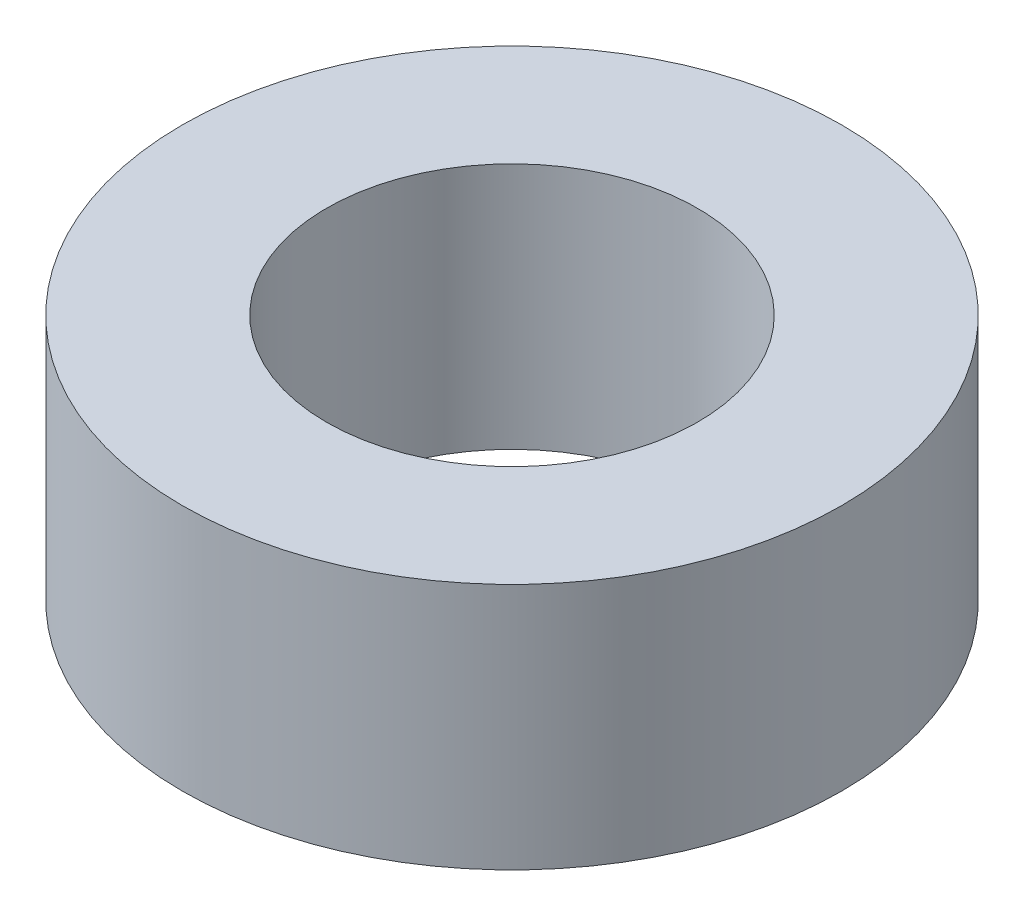
ISO-10303-21;
HEADER;
FILE_DESCRIPTION(('STEP AP214'),'2;1');
FILE_NAME('part.step','',(''),(''),'','','');
FILE_SCHEMA(('AUTOMOTIVE_DESIGN { 1 0 10303 214 1 1 1 1 }'));
ENDSEC;
DATA;
#1=APPLICATION_CONTEXT('core data for automotive mechanical design processes');
#2=APPLICATION_PROTOCOL_DEFINITION('international standard','automotive_design',2000,#1);
#3=PRODUCT_CONTEXT('',#1,'mechanical');
#4=PRODUCT('Part','Part','',(#3));
#5=PRODUCT_RELATED_PRODUCT_CATEGORY('part','',(#4));
#6=PRODUCT_DEFINITION_FORMATION('','',#4);
#7=PRODUCT_DEFINITION_CONTEXT('part definition',#1,'design');
#8=PRODUCT_DEFINITION('design','',#6,#7);
#9=PRODUCT_DEFINITION_SHAPE('','',#8);
#10=(LENGTH_UNIT() NAMED_UNIT(*) SI_UNIT(.MILLI.,.METRE.));
#11=(NAMED_UNIT(*) PLANE_ANGLE_UNIT() SI_UNIT($,.RADIAN.));
#12=(NAMED_UNIT(*) SI_UNIT($,.STERADIAN.) SOLID_ANGLE_UNIT());
#13=UNCERTAINTY_MEASURE_WITH_UNIT(LENGTH_MEASURE(1.E-05),#10,'distance_accuracy_value','');
#14=(GEOMETRIC_REPRESENTATION_CONTEXT(3) GLOBAL_UNCERTAINTY_ASSIGNED_CONTEXT((#13)) GLOBAL_UNIT_ASSIGNED_CONTEXT((#10,
#11,#12)) REPRESENTATION_CONTEXT('',''));
#15=CARTESIAN_POINT('',(0.,0.,0.));
#16=DIRECTION('',(0.,0.,1.));
#17=DIRECTION('',(1.,0.,0.));
#18=AXIS2_PLACEMENT_3D('',#15,#16,#17);
#19=CARTESIAN_POINT('',(0.,3.,0.));
#20=DIRECTION('',(0.,1.,0.));
#21=DIRECTION('',(0.,0.,1.));
#22=AXIS2_PLACEMENT_3D('',#19,#20,#21);
#23=PLANE('',#22);
#24=CARTESIAN_POINT('',(0.,3.,0.));
#25=DIRECTION('',(0.,1.,0.));
#26=DIRECTION('',(0.,0.,1.));
#27=AXIS2_PLACEMENT_3D('',#24,#25,#26);
#28=CIRCLE('',#27,4.);
#29=CARTESIAN_POINT('',(0.,3.,4.));
#30=VERTEX_POINT('',#29);
#31=EDGE_CURVE('E10',#30,#30,#28,.T.);
#32=ORIENTED_EDGE('',*,*,#31,.T.);
#33=EDGE_LOOP('',(#32));
#34=FACE_BOUND('',#33,.T.);
#35=CARTESIAN_POINT('',(0.,3.,0.));
#36=DIRECTION('',(0.,1.,0.));
#37=DIRECTION('',(0.,0.,1.));
#38=AXIS2_PLACEMENT_3D('',#35,#36,#37);
#39=CIRCLE('',#38,2.25);
#40=CARTESIAN_POINT('',(0.,3.,2.25));
#41=VERTEX_POINT('',#40);
#42=EDGE_CURVE('E44',#41,#41,#39,.T.);
#43=ORIENTED_EDGE('',*,*,#42,.F.);
#44=EDGE_LOOP('',(#43));
#45=FACE_BOUND('',#44,.T.);
#46=ADVANCED_FACE('F33',(#34,#45),#23,.T.);
#47=CARTESIAN_POINT('',(0.,0.,0.));
#48=DIRECTION('',(0.,1.,0.));
#49=DIRECTION('',(0.,0.,1.));
#50=AXIS2_PLACEMENT_3D('',#47,#48,#49);
#51=PLANE('',#50);
#52=CARTESIAN_POINT('',(0.,0.,0.));
#53=DIRECTION('',(0.,1.,0.));
#54=DIRECTION('',(0.,0.,1.));
#55=AXIS2_PLACEMENT_3D('',#52,#53,#54);
#56=CIRCLE('',#55,4.);
#57=CARTESIAN_POINT('',(0.,0.,4.));
#58=VERTEX_POINT('',#57);
#59=EDGE_CURVE('E37',#58,#58,#56,.T.);
#60=ORIENTED_EDGE('',*,*,#59,.F.);
#61=EDGE_LOOP('',(#60));
#62=FACE_BOUND('',#61,.T.);
#63=CARTESIAN_POINT('',(0.,0.,0.));
#64=DIRECTION('',(0.,1.,0.));
#65=DIRECTION('',(0.,0.,1.));
#66=AXIS2_PLACEMENT_3D('',#63,#64,#65);
#67=CIRCLE('',#66,2.25);
#68=CARTESIAN_POINT('',(0.,0.,2.25));
#69=VERTEX_POINT('',#68);
#70=EDGE_CURVE('E46',#69,#69,#67,.T.);
#71=ORIENTED_EDGE('',*,*,#70,.T.);
#72=EDGE_LOOP('',(#71));
#73=FACE_BOUND('',#72,.T.);
#74=ADVANCED_FACE('F56',(#62,#73),#51,.F.);
#75=CARTESIAN_POINT('',(0.,3.,0.));
#76=DIRECTION('',(0.,-1.,0.));
#77=DIRECTION('',(0.,0.,-1.));
#78=AXIS2_PLACEMENT_3D('',#75,#76,#77);
#79=CYLINDRICAL_SURFACE('',#78,4.);
#80=ORIENTED_EDGE('',*,*,#31,.F.);
#81=EDGE_LOOP('',(#80));
#82=FACE_BOUND('',#81,.T.);
#83=ORIENTED_EDGE('',*,*,#59,.T.);
#84=EDGE_LOOP('',(#83));
#85=FACE_BOUND('',#84,.T.);
#86=ADVANCED_FACE('F35',(#82,#85),#79,.T.);
#87=CARTESIAN_POINT('',(0.,3.,0.));
#88=DIRECTION('',(0.,-1.,0.));
#89=DIRECTION('',(0.,0.,-1.));
#90=AXIS2_PLACEMENT_3D('',#87,#88,#89);
#91=CYLINDRICAL_SURFACE('',#90,2.25);
#92=ORIENTED_EDGE('',*,*,#42,.T.);
#93=EDGE_LOOP('',(#92));
#94=FACE_BOUND('',#93,.T.);
#95=ORIENTED_EDGE('',*,*,#70,.F.);
#96=EDGE_LOOP('',(#95));
#97=FACE_BOUND('',#96,.T.);
#98=ADVANCED_FACE('F52',(#94,#97),#91,.F.);
#99=CLOSED_SHELL('',(#46,#74,#86,#98));
#100=MANIFOLD_SOLID_BREP('B2',#99);
#101=ADVANCED_BREP_SHAPE_REPRESENTATION('',(#18,#100),#14);
#102=SHAPE_DEFINITION_REPRESENTATION(#9,#101);
ENDSEC;
END-ISO-10303-21;
